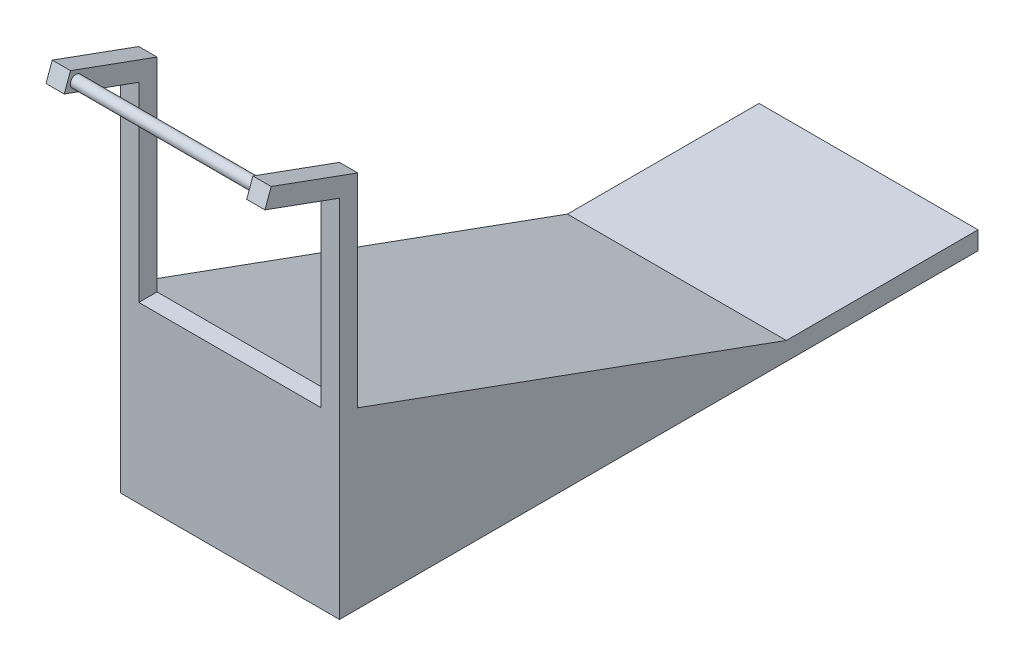
ISO-10303-21;
HEADER;
FILE_DESCRIPTION(('STEP AP214'),'2;1');
FILE_NAME('part.step','',(''),(''),'','','');
FILE_SCHEMA(('AUTOMOTIVE_DESIGN { 1 0 10303 214 1 1 1 1 }'));
ENDSEC;
DATA;
#1=APPLICATION_CONTEXT('core data for automotive mechanical design processes');
#2=APPLICATION_PROTOCOL_DEFINITION('international standard','automotive_design',2000,#1);
#3=PRODUCT_CONTEXT('',#1,'mechanical');
#4=PRODUCT('Part','Part','',(#3));
#5=PRODUCT_RELATED_PRODUCT_CATEGORY('part','',(#4));
#6=PRODUCT_DEFINITION_FORMATION('','',#4);
#7=PRODUCT_DEFINITION_CONTEXT('part definition',#1,'design');
#8=PRODUCT_DEFINITION('design','',#6,#7);
#9=PRODUCT_DEFINITION_SHAPE('','',#8);
#10=(LENGTH_UNIT() NAMED_UNIT(*) SI_UNIT(.MILLI.,.METRE.));
#11=(NAMED_UNIT(*) PLANE_ANGLE_UNIT() SI_UNIT($,.RADIAN.));
#12=(NAMED_UNIT(*) SI_UNIT($,.STERADIAN.) SOLID_ANGLE_UNIT());
#13=UNCERTAINTY_MEASURE_WITH_UNIT(LENGTH_MEASURE(1.E-05),#10,'distance_accuracy_value','');
#14=(GEOMETRIC_REPRESENTATION_CONTEXT(3) GLOBAL_UNCERTAINTY_ASSIGNED_CONTEXT((#13)) GLOBAL_UNIT_ASSIGNED_CONTEXT((#10,
#11,#12)) REPRESENTATION_CONTEXT('',''));
#15=CARTESIAN_POINT('',(0.,0.,0.));
#16=DIRECTION('',(0.,0.,1.));
#17=DIRECTION('',(1.,0.,0.));
#18=AXIS2_PLACEMENT_3D('',#15,#16,#17);
#19=CARTESIAN_POINT('',(24.,19.1010071662835,-2.));
#20=DIRECTION('',(0.,0.,1.));
#21=DIRECTION('',(0.,-1.,0.));
#22=AXIS2_PLACEMENT_3D('',#19,#20,#21);
#23=PLANE('',#22);
#24=DIRECTION('',(-1.,0.,0.));
#25=VECTOR('',#24,1.);
#26=CARTESIAN_POINT('',(24.,19.1010071662835,-2.));
#27=LINE('',#26,#25);
#28=CARTESIAN_POINT('',(24.,19.1010071662835,-2.));
#29=VERTEX_POINT('',#28);
#30=CARTESIAN_POINT('',(22.,19.1010071662835,-2.00000000000001));
#31=VERTEX_POINT('',#30);
#32=EDGE_CURVE('E183',#29,#31,#27,.T.);
#33=ORIENTED_EDGE('',*,*,#32,.T.);
#34=DIRECTION('',(0.,-1.,0.));
#35=VECTOR('',#34,1.);
#36=CARTESIAN_POINT('',(22.,19.1010071662835,-2.00000000000001));
#37=LINE('',#36,#35);
#38=CARTESIAN_POINT('',(22.,41.4004150764194,-2.00000000000002));
#39=VERTEX_POINT('',#38);
#40=EDGE_CURVE('E240',#39,#31,#37,.T.);
#41=ORIENTED_EDGE('',*,*,#40,.F.);
#42=DIRECTION('',(-1.,0.,0.));
#43=VECTOR('',#42,1.);
#44=CARTESIAN_POINT('',(24.,41.4004150764194,-2.));
#45=LINE('',#44,#43);
#46=CARTESIAN_POINT('',(24.,41.4004150764194,-2.));
#47=VERTEX_POINT('',#46);
#48=EDGE_CURVE('E180',#47,#39,#45,.T.);
#49=ORIENTED_EDGE('',*,*,#48,.F.);
#50=DIRECTION('',(0.,1.,0.));
#51=VECTOR('',#50,1.);
#52=CARTESIAN_POINT('',(24.,19.1010071662835,-2.));
#53=LINE('',#52,#51);
#54=EDGE_CURVE('E128',#29,#47,#53,.T.);
#55=ORIENTED_EDGE('',*,*,#54,.F.);
#56=EDGE_LOOP('',(#33,#41,#49,#55));
#57=FACE_BOUND('',#56,.T.);
#58=ADVANCED_FACE('F33',(#57),#23,.F.);
#59=CARTESIAN_POINT('',(24.,41.4004150764194,-2.));
#60=DIRECTION('',(0.,-0.93969262078591,0.342020143325665));
#61=DIRECTION('',(0.,-0.342020143325665,-0.93969262078591));
#62=AXIS2_PLACEMENT_3D('',#59,#60,#61);
#63=PLANE('',#62);
#64=ORIENTED_EDGE('',*,*,#48,.T.);
#65=DIRECTION('',(0.,0.342020143325665,0.93969262078591));
#66=VECTOR('',#65,1.);
#67=CARTESIAN_POINT('',(22.,41.4004150764194,-2.));
#68=LINE('',#67,#66);
#69=CARTESIAN_POINT('',(22.,44.8546731983673,7.49049619101961));
#70=VERTEX_POINT('',#69);
#71=EDGE_CURVE('E138',#39,#70,#68,.T.);
#72=ORIENTED_EDGE('',*,*,#71,.T.);
#73=DIRECTION('',(-1.,0.,0.));
#74=VECTOR('',#73,1.);
#75=CARTESIAN_POINT('',(24.,44.8546731983673,7.49049619101961));
#76=LINE('',#75,#74);
#77=CARTESIAN_POINT('',(24.,44.8546731983673,7.49049619101961));
#78=VERTEX_POINT('',#77);
#79=EDGE_CURVE('E135',#78,#70,#76,.T.);
#80=ORIENTED_EDGE('',*,*,#79,.F.);
#81=DIRECTION('',(0.,0.342020143325665,0.93969262078591));
#82=VECTOR('',#81,1.);
#83=CARTESIAN_POINT('',(24.,41.4004150764194,-2.));
#84=LINE('',#83,#82);
#85=EDGE_CURVE('E121',#47,#78,#84,.T.);
#86=ORIENTED_EDGE('',*,*,#85,.F.);
#87=EDGE_LOOP('',(#64,#72,#80,#86));
#88=FACE_BOUND('',#87,.T.);
#89=ADVANCED_FACE('F136',(#88),#63,.F.);
#90=CARTESIAN_POINT('',(24.,44.8546731983673,7.49049619101961));
#91=DIRECTION('',(0.,-0.342020143325665,-0.93969262078591));
#92=DIRECTION('',(0.,0.93969262078591,-0.342020143325665));
#93=AXIS2_PLACEMENT_3D('',#90,#91,#92);
#94=PLANE('',#93);
#95=ORIENTED_EDGE('',*,*,#79,.T.);
#96=DIRECTION('',(0.,-0.93969262078591,0.342020143325665));
#97=VECTOR('',#96,1.);
#98=CARTESIAN_POINT('',(22.,44.8546731983673,7.49049619101961));
#99=LINE('',#98,#97);
#100=CARTESIAN_POINT('',(22.,42.9752879567955,8.17453647767094));
#101=VERTEX_POINT('',#100);
#102=EDGE_CURVE('E265',#70,#101,#99,.T.);
#103=ORIENTED_EDGE('',*,*,#102,.T.);
#104=DIRECTION('',(-1.,0.,0.));
#105=VECTOR('',#104,1.);
#106=CARTESIAN_POINT('',(24.,42.9752879567955,8.17453647767094));
#107=LINE('',#106,#105);
#108=CARTESIAN_POINT('',(24.,42.9752879567955,8.17453647767094));
#109=VERTEX_POINT('',#108);
#110=EDGE_CURVE('E146',#109,#101,#107,.T.);
#111=ORIENTED_EDGE('',*,*,#110,.F.);
#112=DIRECTION('',(0.,-0.93969262078591,0.342020143325665));
#113=VECTOR('',#112,1.);
#114=CARTESIAN_POINT('',(24.,44.8546731983673,7.49049619101961));
#115=LINE('',#114,#113);
#116=EDGE_CURVE('E125',#78,#109,#115,.T.);
#117=ORIENTED_EDGE('',*,*,#116,.F.);
#118=EDGE_LOOP('',(#95,#103,#111,#117));
#119=FACE_BOUND('',#118,.T.);
#120=ADVANCED_FACE('F144',(#119),#94,.F.);
#121=CARTESIAN_POINT('',(24.,42.9752879567955,8.17453647767094));
#122=DIRECTION('',(0.,0.93969262078591,-0.342020143325665));
#123=DIRECTION('',(0.,0.342020143325665,0.93969262078591));
#124=AXIS2_PLACEMENT_3D('',#121,#122,#123);
#125=PLANE('',#124);
#126=ORIENTED_EDGE('',*,*,#110,.T.);
#127=DIRECTION('',(0.,-0.342020143325665,-0.93969262078591));
#128=VECTOR('',#127,1.);
#129=CARTESIAN_POINT('',(22.,42.9752879567955,8.17453647767094));
#130=LINE('',#129,#128);
#131=CARTESIAN_POINT('',(22.,40.,0.));
#132=VERTEX_POINT('',#131);
#133=EDGE_CURVE('E199',#101,#132,#130,.T.);
#134=ORIENTED_EDGE('',*,*,#133,.T.);
#135=DIRECTION('',(-1.,0.,0.));
#136=VECTOR('',#135,1.);
#137=CARTESIAN_POINT('',(24.,40.,0.));
#138=LINE('',#137,#136);
#139=CARTESIAN_POINT('',(24.,40.,0.));
#140=VERTEX_POINT('',#139);
#141=EDGE_CURVE('E175',#140,#132,#138,.T.);
#142=ORIENTED_EDGE('',*,*,#141,.F.);
#143=DIRECTION('',(0.,-0.342020143325665,-0.93969262078591));
#144=VECTOR('',#143,1.);
#145=CARTESIAN_POINT('',(24.,42.9752879567955,8.17453647767094));
#146=LINE('',#145,#144);
#147=EDGE_CURVE('E57',#109,#140,#146,.T.);
#148=ORIENTED_EDGE('',*,*,#147,.F.);
#149=EDGE_LOOP('',(#126,#134,#142,#148));
#150=FACE_BOUND('',#149,.T.);
#151=ADVANCED_FACE('F301',(#150),#125,.F.);
#152=CARTESIAN_POINT('',(24.,40.,0.));
#153=DIRECTION('',(0.,0.,-1.));
#154=DIRECTION('',(0.,1.,0.));
#155=AXIS2_PLACEMENT_3D('',#152,#153,#154);
#156=PLANE('',#155);
#157=ORIENTED_EDGE('',*,*,#141,.T.);
#158=DIRECTION('',(0.,-1.,0.));
#159=VECTOR('',#158,1.);
#160=CARTESIAN_POINT('',(22.,40.,0.));
#161=LINE('',#160,#159);
#162=CARTESIAN_POINT('',(22.,19.1010071662835,0.));
#163=VERTEX_POINT('',#162);
#164=EDGE_CURVE('E272',#132,#163,#161,.T.);
#165=ORIENTED_EDGE('',*,*,#164,.T.);
#166=DIRECTION('',(-1.,0.,0.));
#167=VECTOR('',#166,1.);
#168=CARTESIAN_POINT('',(24.,19.1010071662835,0.));
#169=LINE('',#168,#167);
#170=CARTESIAN_POINT('',(2.,19.1010071662835,0.));
#171=VERTEX_POINT('',#170);
#172=EDGE_CURVE('E154',#163,#171,#169,.T.);
#173=ORIENTED_EDGE('',*,*,#172,.T.);
#174=DIRECTION('',(0.,1.,0.));
#175=VECTOR('',#174,1.);
#176=CARTESIAN_POINT('',(2.,40.,0.));
#177=LINE('',#176,#175);
#178=CARTESIAN_POINT('',(2.,40.,0.));
#179=VERTEX_POINT('',#178);
#180=EDGE_CURVE('E223',#171,#179,#177,.T.);
#181=ORIENTED_EDGE('',*,*,#180,.T.);
#182=CARTESIAN_POINT('',(0.,40.,0.));
#183=VERTEX_POINT('',#182);
#184=EDGE_CURVE('E94',#179,#183,#138,.T.);
#185=ORIENTED_EDGE('',*,*,#184,.T.);
#186=DIRECTION('',(0.,-1.,0.));
#187=VECTOR('',#186,1.);
#188=CARTESIAN_POINT('',(0.,40.,0.));
#189=LINE('',#188,#187);
#190=CARTESIAN_POINT('',(0.,0.,0.));
#191=VERTEX_POINT('',#190);
#192=EDGE_CURVE('E151',#183,#191,#189,.T.);
#193=ORIENTED_EDGE('',*,*,#192,.T.);
#194=DIRECTION('',(-1.,0.,0.));
#195=VECTOR('',#194,1.);
#196=CARTESIAN_POINT('',(24.,0.,0.));
#197=LINE('',#196,#195);
#198=CARTESIAN_POINT('',(24.,0.,0.));
#199=VERTEX_POINT('',#198);
#200=EDGE_CURVE('E195',#199,#191,#197,.T.);
#201=ORIENTED_EDGE('',*,*,#200,.F.);
#202=DIRECTION('',(0.,-1.,0.));
#203=VECTOR('',#202,1.);
#204=CARTESIAN_POINT('',(24.,40.,0.));
#205=LINE('',#204,#203);
#206=EDGE_CURVE('E174',#140,#199,#205,.T.);
#207=ORIENTED_EDGE('',*,*,#206,.F.);
#208=EDGE_LOOP('',(#157,#165,#173,#181,#185,#193,#201,#207));
#209=FACE_BOUND('',#208,.T.);
#210=ADVANCED_FACE('F35',(#209),#156,.F.);
#211=CARTESIAN_POINT('',(24.,0.,0.));
#212=DIRECTION('',(0.,1.,0.));
#213=DIRECTION('',(0.,0.,1.));
#214=AXIS2_PLACEMENT_3D('',#211,#212,#213);
#215=PLANE('',#214);
#216=DIRECTION('',(0.,0.,-1.));
#217=VECTOR('',#216,1.);
#218=CARTESIAN_POINT('',(0.,0.,0.));
#219=LINE('',#218,#217);
#220=CARTESIAN_POINT('',(0.,0.,-70.));
#221=VERTEX_POINT('',#220);
#222=EDGE_CURVE('E153',#191,#221,#219,.T.);
#223=ORIENTED_EDGE('',*,*,#222,.T.);
#224=DIRECTION('',(-1.,0.,0.));
#225=VECTOR('',#224,1.);
#226=CARTESIAN_POINT('',(24.,0.,-70.));
#227=LINE('',#226,#225);
#228=CARTESIAN_POINT('',(24.,0.,-70.));
#229=VERTEX_POINT('',#228);
#230=EDGE_CURVE('E192',#229,#221,#227,.T.);
#231=ORIENTED_EDGE('',*,*,#230,.F.);
#232=DIRECTION('',(0.,0.,-1.));
#233=VECTOR('',#232,1.);
#234=CARTESIAN_POINT('',(24.,0.,0.));
#235=LINE('',#234,#233);
#236=EDGE_CURVE('E103',#199,#229,#235,.T.);
#237=ORIENTED_EDGE('',*,*,#236,.F.);
#238=ORIENTED_EDGE('',*,*,#200,.T.);
#239=EDGE_LOOP('',(#223,#231,#237,#238));
#240=FACE_BOUND('',#239,.T.);
#241=ADVANCED_FACE('F306',(#240),#215,.F.);
#242=CARTESIAN_POINT('',(24.,0.,-70.));
#243=DIRECTION('',(0.,0.,1.));
#244=DIRECTION('',(1.,0.,0.));
#245=AXIS2_PLACEMENT_3D('',#242,#243,#244);
#246=PLANE('',#245);
#247=DIRECTION('',(0.,1.,0.));
#248=VECTOR('',#247,1.);
#249=CARTESIAN_POINT('',(0.,0.,-70.));
#250=LINE('',#249,#248);
#251=CARTESIAN_POINT('',(0.,2.,-70.));
#252=VERTEX_POINT('',#251);
#253=EDGE_CURVE('E156',#221,#252,#250,.T.);
#254=ORIENTED_EDGE('',*,*,#253,.T.);
#255=DIRECTION('',(-1.,0.,0.));
#256=VECTOR('',#255,1.);
#257=CARTESIAN_POINT('',(24.,2.,-70.));
#258=LINE('',#257,#256);
#259=CARTESIAN_POINT('',(24.,2.,-70.));
#260=VERTEX_POINT('',#259);
#261=EDGE_CURVE('E189',#260,#252,#258,.T.);
#262=ORIENTED_EDGE('',*,*,#261,.F.);
#263=DIRECTION('',(0.,1.,0.));
#264=VECTOR('',#263,1.);
#265=CARTESIAN_POINT('',(24.,0.,-70.));
#266=LINE('',#265,#264);
#267=EDGE_CURVE('E278',#229,#260,#266,.T.);
#268=ORIENTED_EDGE('',*,*,#267,.F.);
#269=ORIENTED_EDGE('',*,*,#230,.T.);
#270=EDGE_LOOP('',(#254,#262,#268,#269));
#271=FACE_BOUND('',#270,.T.);
#272=ADVANCED_FACE('F309',(#271),#246,.F.);
#273=CARTESIAN_POINT('',(24.,2.,-70.));
#274=DIRECTION('',(0.,-1.,0.));
#275=DIRECTION('',(0.,0.,-1.));
#276=AXIS2_PLACEMENT_3D('',#273,#274,#275);
#277=PLANE('',#276);
#278=DIRECTION('',(0.,0.,1.));
#279=VECTOR('',#278,1.);
#280=CARTESIAN_POINT('',(0.,2.,-70.));
#281=LINE('',#280,#279);
#282=CARTESIAN_POINT('',(0.,2.,-48.9846310392954));
#283=VERTEX_POINT('',#282);
#284=EDGE_CURVE('E158',#252,#283,#281,.T.);
#285=ORIENTED_EDGE('',*,*,#284,.T.);
#286=DIRECTION('',(-1.,0.,0.));
#287=VECTOR('',#286,1.);
#288=CARTESIAN_POINT('',(24.,2.,-48.9846310392954));
#289=LINE('',#288,#287);
#290=CARTESIAN_POINT('',(24.,2.,-48.9846310392954));
#291=VERTEX_POINT('',#290);
#292=EDGE_CURVE('E186',#291,#283,#289,.T.);
#293=ORIENTED_EDGE('',*,*,#292,.F.);
#294=DIRECTION('',(0.,0.,1.));
#295=VECTOR('',#294,1.);
#296=CARTESIAN_POINT('',(24.,2.,-70.));
#297=LINE('',#296,#295);
#298=EDGE_CURVE('E280',#260,#291,#297,.T.);
#299=ORIENTED_EDGE('',*,*,#298,.F.);
#300=ORIENTED_EDGE('',*,*,#261,.T.);
#301=EDGE_LOOP('',(#285,#293,#299,#300));
#302=FACE_BOUND('',#301,.T.);
#303=ADVANCED_FACE('F311',(#302),#277,.F.);
#304=CARTESIAN_POINT('',(24.,2.,-48.9846310392954));
#305=DIRECTION('',(0.,-0.939692620785908,0.342020143325669));
#306=DIRECTION('',(0.,-0.342020143325669,-0.939692620785908));
#307=AXIS2_PLACEMENT_3D('',#304,#305,#306);
#308=PLANE('',#307);
#309=DIRECTION('',(0.,0.342020143325669,0.939692620785908));
#310=VECTOR('',#309,1.);
#311=CARTESIAN_POINT('',(0.,2.,-48.9846310392954));
#312=LINE('',#311,#310);
#313=CARTESIAN_POINT('',(0.,19.1010071662835,-2.));
#314=VERTEX_POINT('',#313);
#315=EDGE_CURVE('E160',#283,#314,#312,.T.);
#316=ORIENTED_EDGE('',*,*,#315,.T.);
#317=CARTESIAN_POINT('',(2.,19.1010071662835,-2.00000000000001));
#318=VERTEX_POINT('',#317);
#319=EDGE_CURVE('E182',#318,#314,#27,.T.);
#320=ORIENTED_EDGE('',*,*,#319,.F.);
#321=DIRECTION('',(-1.,0.,0.));
#322=VECTOR('',#321,1.);
#323=CARTESIAN_POINT('',(22.,19.1010071662835,-2.00000000000001));
#324=LINE('',#323,#322);
#325=EDGE_CURVE('E233',#31,#318,#324,.T.);
#326=ORIENTED_EDGE('',*,*,#325,.F.);
#327=ORIENTED_EDGE('',*,*,#32,.F.);
#328=DIRECTION('',(0.,0.342020143325669,0.939692620785908));
#329=VECTOR('',#328,1.);
#330=CARTESIAN_POINT('',(24.,2.,-48.9846310392954));
#331=LINE('',#330,#329);
#332=EDGE_CURVE('E282',#291,#29,#331,.T.);
#333=ORIENTED_EDGE('',*,*,#332,.F.);
#334=ORIENTED_EDGE('',*,*,#292,.T.);
#335=EDGE_LOOP('',(#316,#320,#326,#327,#333,#334));
#336=FACE_BOUND('',#335,.T.);
#337=ADVANCED_FACE('F246',(#336),#308,.F.);
#338=CARTESIAN_POINT('',(2.,41.4004150764194,-2.00000000000002));
#339=VERTEX_POINT('',#338);
#340=CARTESIAN_POINT('',(0.,41.4004150764194,-2.));
#341=VERTEX_POINT('',#340);
#342=EDGE_CURVE('E141',#339,#341,#45,.T.);
#343=ORIENTED_EDGE('',*,*,#342,.F.);
#344=DIRECTION('',(0.,1.,0.));
#345=VECTOR('',#344,1.);
#346=CARTESIAN_POINT('',(2.,19.1010071662835,-2.00000000000001));
#347=LINE('',#346,#345);
#348=EDGE_CURVE('E220',#318,#339,#347,.T.);
#349=ORIENTED_EDGE('',*,*,#348,.F.);
#350=ORIENTED_EDGE('',*,*,#319,.T.);
#351=DIRECTION('',(0.,1.,0.));
#352=VECTOR('',#351,1.);
#353=CARTESIAN_POINT('',(0.,19.1010071662835,-2.));
#354=LINE('',#353,#352);
#355=EDGE_CURVE('E163',#314,#341,#354,.T.);
#356=ORIENTED_EDGE('',*,*,#355,.T.);
#357=EDGE_LOOP('',(#343,#349,#350,#356));
#358=FACE_BOUND('',#357,.T.);
#359=ADVANCED_FACE('F244',(#358),#23,.F.);
#360=CARTESIAN_POINT('',(2.,44.8546731983673,7.49049619101961));
#361=VERTEX_POINT('',#360);
#362=CARTESIAN_POINT('',(0.,44.8546731983673,7.49049619101961));
#363=VERTEX_POINT('',#362);
#364=EDGE_CURVE('E142',#361,#363,#76,.T.);
#365=ORIENTED_EDGE('',*,*,#364,.F.);
#366=DIRECTION('',(0.,-0.342020143325665,-0.93969262078591));
#367=VECTOR('',#366,1.);
#368=CARTESIAN_POINT('',(2.,41.4004150764194,-2.));
#369=LINE('',#368,#367);
#370=EDGE_CURVE('E262',#361,#339,#369,.T.);
#371=ORIENTED_EDGE('',*,*,#370,.T.);
#372=ORIENTED_EDGE('',*,*,#342,.T.);
#373=DIRECTION('',(0.,0.342020143325665,0.93969262078591));
#374=VECTOR('',#373,1.);
#375=CARTESIAN_POINT('',(0.,41.4004150764194,-2.));
#376=LINE('',#375,#374);
#377=EDGE_CURVE('E166',#341,#363,#376,.T.);
#378=ORIENTED_EDGE('',*,*,#377,.T.);
#379=EDGE_LOOP('',(#365,#371,#372,#378));
#380=FACE_BOUND('',#379,.T.);
#381=ADVANCED_FACE('F260',(#380),#63,.F.);
#382=CARTESIAN_POINT('',(2.,42.9752879567955,8.17453647767094));
#383=VERTEX_POINT('',#382);
#384=CARTESIAN_POINT('',(0.,42.9752879567955,8.17453647767094));
#385=VERTEX_POINT('',#384);
#386=EDGE_CURVE('E178',#383,#385,#107,.T.);
#387=ORIENTED_EDGE('',*,*,#386,.F.);
#388=DIRECTION('',(0.,0.93969262078591,-0.342020143325665));
#389=VECTOR('',#388,1.);
#390=CARTESIAN_POINT('',(2.,44.8546731983673,7.49049619101961));
#391=LINE('',#390,#389);
#392=EDGE_CURVE('E48',#383,#361,#391,.T.);
#393=ORIENTED_EDGE('',*,*,#392,.T.);
#394=ORIENTED_EDGE('',*,*,#364,.T.);
#395=DIRECTION('',(0.,-0.93969262078591,0.342020143325665));
#396=VECTOR('',#395,1.);
#397=CARTESIAN_POINT('',(0.,44.8546731983673,7.49049619101961));
#398=LINE('',#397,#396);
#399=EDGE_CURVE('E169',#363,#385,#398,.T.);
#400=ORIENTED_EDGE('',*,*,#399,.T.);
#401=EDGE_LOOP('',(#387,#393,#394,#400));
#402=FACE_BOUND('',#401,.T.);
#403=ADVANCED_FACE('F316',(#402),#94,.F.);
#404=ORIENTED_EDGE('',*,*,#184,.F.);
#405=DIRECTION('',(0.,0.342020143325665,0.93969262078591));
#406=VECTOR('',#405,1.);
#407=CARTESIAN_POINT('',(2.,42.9752879567955,8.17453647767094));
#408=LINE('',#407,#406);
#409=EDGE_CURVE('E197',#179,#383,#408,.T.);
#410=ORIENTED_EDGE('',*,*,#409,.T.);
#411=ORIENTED_EDGE('',*,*,#386,.T.);
#412=DIRECTION('',(0.,-0.342020143325665,-0.93969262078591));
#413=VECTOR('',#412,1.);
#414=CARTESIAN_POINT('',(0.,42.9752879567955,8.17453647767094));
#415=LINE('',#414,#413);
#416=EDGE_CURVE('E172',#385,#183,#415,.T.);
#417=ORIENTED_EDGE('',*,*,#416,.T.);
#418=EDGE_LOOP('',(#404,#410,#411,#417));
#419=FACE_BOUND('',#418,.T.);
#420=ADVANCED_FACE('F313',(#419),#125,.F.);
#421=CARTESIAN_POINT('',(24.,0.,0.));
#422=DIRECTION('',(1.,0.,0.));
#423=DIRECTION('',(0.,0.,-1.));
#424=AXIS2_PLACEMENT_3D('',#421,#422,#423);
#425=PLANE('',#424);
#426=ORIENTED_EDGE('',*,*,#206,.T.);
#427=ORIENTED_EDGE('',*,*,#236,.T.);
#428=ORIENTED_EDGE('',*,*,#267,.T.);
#429=ORIENTED_EDGE('',*,*,#298,.T.);
#430=ORIENTED_EDGE('',*,*,#332,.T.);
#431=ORIENTED_EDGE('',*,*,#54,.T.);
#432=ORIENTED_EDGE('',*,*,#85,.T.);
#433=ORIENTED_EDGE('',*,*,#116,.T.);
#434=ORIENTED_EDGE('',*,*,#147,.T.);
#435=EDGE_LOOP('',(#426,#427,#428,#429,#430,#431,#432,#433,#434));
#436=FACE_BOUND('',#435,.T.);
#437=ADVANCED_FACE('F123',(#436),#425,.T.);
#438=CARTESIAN_POINT('',(0.,0.,0.));
#439=DIRECTION('',(1.,0.,0.));
#440=DIRECTION('',(0.,0.,-1.));
#441=AXIS2_PLACEMENT_3D('',#438,#439,#440);
#442=PLANE('',#441);
#443=ORIENTED_EDGE('',*,*,#192,.F.);
#444=ORIENTED_EDGE('',*,*,#416,.F.);
#445=ORIENTED_EDGE('',*,*,#399,.F.);
#446=ORIENTED_EDGE('',*,*,#377,.F.);
#447=ORIENTED_EDGE('',*,*,#355,.F.);
#448=ORIENTED_EDGE('',*,*,#315,.F.);
#449=ORIENTED_EDGE('',*,*,#284,.F.);
#450=ORIENTED_EDGE('',*,*,#253,.F.);
#451=ORIENTED_EDGE('',*,*,#222,.F.);
#452=EDGE_LOOP('',(#443,#444,#445,#446,#447,#448,#449,#450,#451));
#453=FACE_BOUND('',#452,.T.);
#454=ADVANCED_FACE('F255',(#453),#442,.F.);
#455=CARTESIAN_POINT('',(22.,19.1010071662835,18.));
#456=DIRECTION('',(0.,-1.,0.));
#457=DIRECTION('',(0.,0.,-1.));
#458=AXIS2_PLACEMENT_3D('',#455,#456,#457);
#459=PLANE('',#458);
#460=DIRECTION('',(0.,0.,-1.));
#461=VECTOR('',#460,1.);
#462=CARTESIAN_POINT('',(22.,19.1010071662835,18.));
#463=LINE('',#462,#461);
#464=EDGE_CURVE('E229',#163,#31,#463,.T.);
#465=ORIENTED_EDGE('',*,*,#464,.T.);
#466=ORIENTED_EDGE('',*,*,#325,.T.);
#467=DIRECTION('',(0.,0.,-1.));
#468=VECTOR('',#467,1.);
#469=CARTESIAN_POINT('',(2.,19.1010071662835,18.));
#470=LINE('',#469,#468);
#471=EDGE_CURVE('E216',#171,#318,#470,.T.);
#472=ORIENTED_EDGE('',*,*,#471,.F.);
#473=ORIENTED_EDGE('',*,*,#172,.F.);
#474=EDGE_LOOP('',(#465,#466,#472,#473));
#475=FACE_BOUND('',#474,.T.);
#476=ADVANCED_FACE('F234',(#475),#459,.F.);
#477=CARTESIAN_POINT('',(22.,19.1010071662835,18.));
#478=DIRECTION('',(1.,0.,0.));
#479=DIRECTION('',(0.,0.,-1.));
#480=AXIS2_PLACEMENT_3D('',#477,#478,#479);
#481=PLANE('',#480);
#482=CARTESIAN_POINT('',(22.,43.5729604342557,6.89282371355937));
#483=DIRECTION('',(1.,0.,0.));
#484=DIRECTION('',(0.,0.,-1.));
#485=AXIS2_PLACEMENT_3D('',#482,#483,#484);
#486=CIRCLE('',#485,0.625);
#487=CARTESIAN_POINT('',(22.,43.5729604342557,6.26782371355937));
#488=VERTEX_POINT('',#487);
#489=EDGE_CURVE('E11',#488,#488,#486,.F.);
#490=ORIENTED_EDGE('',*,*,#489,.F.);
#491=EDGE_LOOP('',(#490));
#492=FACE_BOUND('',#491,.T.);
#493=ORIENTED_EDGE('',*,*,#133,.F.);
#494=ORIENTED_EDGE('',*,*,#102,.F.);
#495=ORIENTED_EDGE('',*,*,#71,.F.);
#496=ORIENTED_EDGE('',*,*,#40,.T.);
#497=ORIENTED_EDGE('',*,*,#464,.F.);
#498=ORIENTED_EDGE('',*,*,#164,.F.);
#499=EDGE_LOOP('',(#493,#494,#495,#496,#497,#498));
#500=FACE_BOUND('',#499,.T.);
#501=ADVANCED_FACE('F209',(#492,#500),#481,.F.);
#502=CARTESIAN_POINT('',(2.,19.1010071662835,18.));
#503=DIRECTION('',(-1.,0.,0.));
#504=DIRECTION('',(0.,-1.,0.));
#505=AXIS2_PLACEMENT_3D('',#502,#503,#504);
#506=PLANE('',#505);
#507=CARTESIAN_POINT('',(2.,43.5729604342557,6.89282371355937));
#508=DIRECTION('',(-1.,0.,0.));
#509=DIRECTION('',(0.,-1.,0.));
#510=AXIS2_PLACEMENT_3D('',#507,#508,#509);
#511=CIRCLE('',#510,0.625);
#512=CARTESIAN_POINT('',(2.,42.9479604342557,6.89282371355937));
#513=VERTEX_POINT('',#512);
#514=EDGE_CURVE('E41',#513,#513,#511,.F.);
#515=ORIENTED_EDGE('',*,*,#514,.F.);
#516=EDGE_LOOP('',(#515));
#517=FACE_BOUND('',#516,.T.);
#518=ORIENTED_EDGE('',*,*,#471,.T.);
#519=ORIENTED_EDGE('',*,*,#348,.T.);
#520=ORIENTED_EDGE('',*,*,#370,.F.);
#521=ORIENTED_EDGE('',*,*,#392,.F.);
#522=ORIENTED_EDGE('',*,*,#409,.F.);
#523=ORIENTED_EDGE('',*,*,#180,.F.);
#524=EDGE_LOOP('',(#518,#519,#520,#521,#522,#523));
#525=FACE_BOUND('',#524,.T.);
#526=ADVANCED_FACE('F207',(#517,#525),#506,.F.);
#527=CARTESIAN_POINT('',(24.002,43.5729604342557,6.89282371355937));
#528=DIRECTION('',(-1.,0.,0.));
#529=DIRECTION('',(0.,0.,1.));
#530=AXIS2_PLACEMENT_3D('',#527,#528,#529);
#531=CYLINDRICAL_SURFACE('',#530,0.625);
#532=ORIENTED_EDGE('',*,*,#514,.T.);
#533=EDGE_LOOP('',(#532));
#534=FACE_BOUND('',#533,.T.);
#535=ORIENTED_EDGE('',*,*,#489,.T.);
#536=EDGE_LOOP('',(#535));
#537=FACE_BOUND('',#536,.T.);
#538=ADVANCED_FACE('F204',(#534,#537),#531,.T.);
#539=CLOSED_SHELL('',(#58,#89,#120,#151,#210,#241,#272,#303,#337,#359,#381,#403,#420,#437,#454,
#476,#501,#526,#538));
#540=MANIFOLD_SOLID_BREP('B2',#539);
#541=ADVANCED_BREP_SHAPE_REPRESENTATION('',(#18,#540),#14);
#542=SHAPE_DEFINITION_REPRESENTATION(#9,#541);
ENDSEC;
END-ISO-10303-21;
